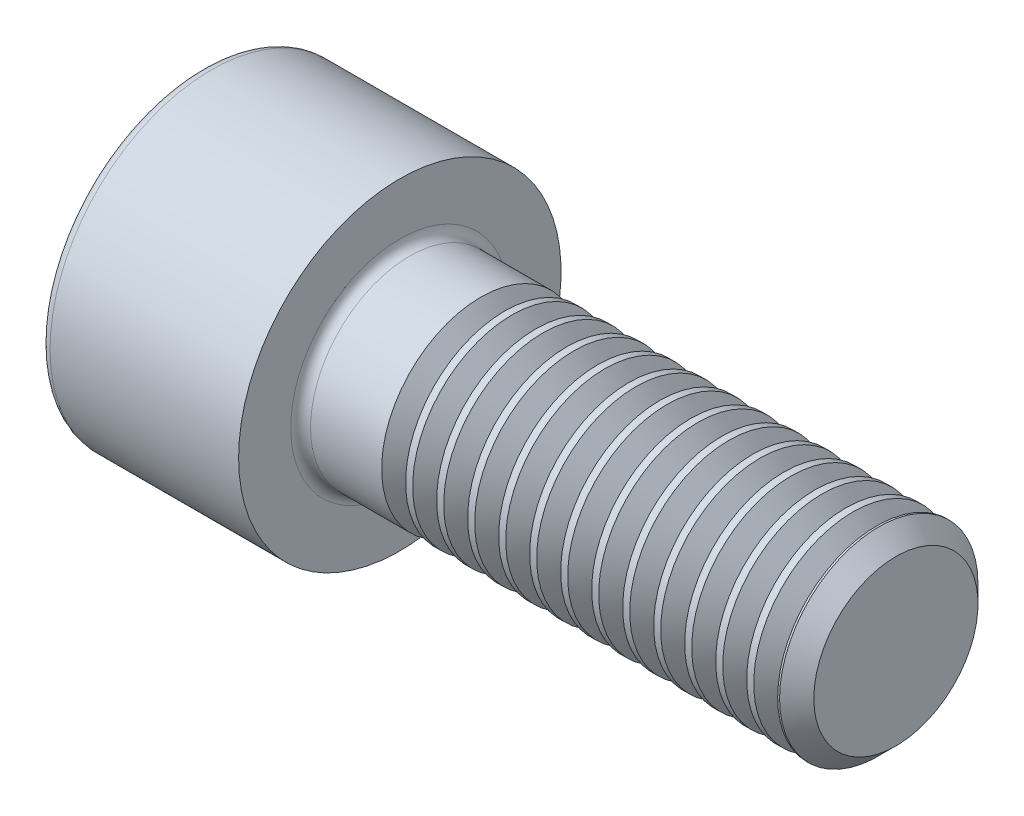
ISO-10303-21;
HEADER;
FILE_DESCRIPTION(('STEP AP214'),'2;1');
FILE_NAME('part.step','',(''),(''),'','','');
FILE_SCHEMA(('AUTOMOTIVE_DESIGN { 1 0 10303 214 1 1 1 1 }'));
ENDSEC;
DATA;
#1=APPLICATION_CONTEXT('core data for automotive mechanical design processes');
#2=APPLICATION_PROTOCOL_DEFINITION('international standard','automotive_design',2000,#1);
#3=PRODUCT_CONTEXT('',#1,'mechanical');
#4=PRODUCT('Part','Part','',(#3));
#5=PRODUCT_RELATED_PRODUCT_CATEGORY('part','',(#4));
#6=PRODUCT_DEFINITION_FORMATION('','',#4);
#7=PRODUCT_DEFINITION_CONTEXT('part definition',#1,'design');
#8=PRODUCT_DEFINITION('design','',#6,#7);
#9=PRODUCT_DEFINITION_SHAPE('','',#8);
#10=(LENGTH_UNIT() NAMED_UNIT(*) SI_UNIT(.MILLI.,.METRE.));
#11=(NAMED_UNIT(*) PLANE_ANGLE_UNIT() SI_UNIT($,.RADIAN.));
#12=(NAMED_UNIT(*) SI_UNIT($,.STERADIAN.) SOLID_ANGLE_UNIT());
#13=UNCERTAINTY_MEASURE_WITH_UNIT(LENGTH_MEASURE(1.E-05),#10,'distance_accuracy_value','');
#14=(GEOMETRIC_REPRESENTATION_CONTEXT(3) GLOBAL_UNCERTAINTY_ASSIGNED_CONTEXT((#13)) GLOBAL_UNIT_ASSIGNED_CONTEXT((#10,
#11,#12)) REPRESENTATION_CONTEXT('',''));
#15=CARTESIAN_POINT('',(0.,0.,0.));
#16=DIRECTION('',(0.,0.,1.));
#17=DIRECTION('',(1.,0.,0.));
#18=AXIS2_PLACEMENT_3D('',#15,#16,#17);
#19=CARTESIAN_POINT('',(0.,0.,0.));
#20=DIRECTION('',(-1.,0.,0.));
#21=DIRECTION('',(0.,0.,1.));
#22=AXIS2_PLACEMENT_3D('',#19,#20,#21);
#23=PLANE('',#22);
#24=DIRECTION('',(0.,-0.500000000000001,0.866025403784441));
#25=VECTOR('',#24,1.);
#26=CARTESIAN_POINT('',(0.,3.51894989071077,0.));
#27=LINE('',#26,#25);
#28=CARTESIAN_POINT('',(0.,3.51894989071077,0.));
#29=VERTEX_POINT('',#28);
#30=CARTESIAN_POINT('',(0.,1.75947494535539,3.04750000000001));
#31=VERTEX_POINT('',#30);
#32=EDGE_CURVE('E447',#29,#31,#27,.T.);
#33=ORIENTED_EDGE('',*,*,#32,.T.);
#34=DIRECTION('',(0.,1.,0.));
#35=VECTOR('',#34,1.);
#36=CARTESIAN_POINT('',(0.,-1.75947494535539,3.04750000000001));
#37=LINE('',#36,#35);
#38=CARTESIAN_POINT('',(0.,-1.75947494535539,3.04750000000001));
#39=VERTEX_POINT('',#38);
#40=EDGE_CURVE('E112',#39,#31,#37,.T.);
#41=ORIENTED_EDGE('',*,*,#40,.F.);
#42=DIRECTION('',(0.,-0.500000000000001,-0.86602540378444));
#43=VECTOR('',#42,1.);
#44=CARTESIAN_POINT('',(0.,-1.75947494535539,3.04750000000001));
#45=LINE('',#44,#43);
#46=CARTESIAN_POINT('',(0.,-3.51894989071078,0.));
#47=VERTEX_POINT('',#46);
#48=EDGE_CURVE('E466',#39,#47,#45,.T.);
#49=ORIENTED_EDGE('',*,*,#48,.T.);
#50=DIRECTION('',(0.,0.500000000000001,-0.866025403784441));
#51=VECTOR('',#50,1.);
#52=CARTESIAN_POINT('',(0.,-3.51894989071078,0.));
#53=LINE('',#52,#51);
#54=CARTESIAN_POINT('',(0.,-1.75947494535539,-3.04750000000001));
#55=VERTEX_POINT('',#54);
#56=EDGE_CURVE('E469',#47,#55,#53,.T.);
#57=ORIENTED_EDGE('',*,*,#56,.T.);
#58=DIRECTION('',(0.,-1.,0.));
#59=VECTOR('',#58,1.);
#60=CARTESIAN_POINT('',(0.,1.75947494535538,-3.04750000000001));
#61=LINE('',#60,#59);
#62=CARTESIAN_POINT('',(0.,1.75947494535538,-3.04750000000001));
#63=VERTEX_POINT('',#62);
#64=EDGE_CURVE('E472',#63,#55,#61,.T.);
#65=ORIENTED_EDGE('',*,*,#64,.F.);
#66=DIRECTION('',(0.,-0.500000000000001,-0.86602540378444));
#67=VECTOR('',#66,1.);
#68=CARTESIAN_POINT('',(0.,3.51894989071077,0.));
#69=LINE('',#68,#67);
#70=EDGE_CURVE('E107',#29,#63,#69,.T.);
#71=ORIENTED_EDGE('',*,*,#70,.F.);
#72=EDGE_LOOP('',(#33,#41,#49,#57,#65,#71));
#73=FACE_BOUND('',#72,.T.);
#74=CARTESIAN_POINT('',(0.,0.,0.));
#75=DIRECTION('',(-1.,0.,0.));
#76=DIRECTION('',(0.,0.,1.));
#77=AXIS2_PLACEMENT_3D('',#74,#75,#76);
#78=CIRCLE('',#77,6.1);
#79=CARTESIAN_POINT('',(0.,0.,6.10000000000001));
#80=VERTEX_POINT('',#79);
#81=EDGE_CURVE('E24',#80,#80,#78,.T.);
#82=ORIENTED_EDGE('',*,*,#81,.T.);
#83=EDGE_LOOP('',(#82));
#84=FACE_BOUND('',#83,.T.);
#85=ADVANCED_FACE('F16',(#73,#84),#23,.T.);
#86=CARTESIAN_POINT('',(-31.75,0.,0.));
#87=DIRECTION('',(-1.,0.,0.));
#88=DIRECTION('',(0.,0.,1.));
#89=AXIS2_PLACEMENT_3D('',#86,#87,#88);
#90=CYLINDRICAL_SURFACE('',#89,6.5);
#91=CARTESIAN_POINT('',(0.399999999999998,0.,0.));
#92=DIRECTION('',(-1.,0.,0.));
#93=DIRECTION('',(0.,0.,1.));
#94=AXIS2_PLACEMENT_3D('',#91,#92,#93);
#95=CIRCLE('',#94,6.5);
#96=CARTESIAN_POINT('',(0.399999999999998,0.,6.50000000000001));
#97=VERTEX_POINT('',#96);
#98=EDGE_CURVE('E11',#97,#97,#95,.F.);
#99=ORIENTED_EDGE('',*,*,#98,.T.);
#100=EDGE_LOOP('',(#99));
#101=FACE_BOUND('',#100,.T.);
#102=CARTESIAN_POINT('',(8.00000000000001,0.,0.));
#103=DIRECTION('',(-1.,0.,0.));
#104=DIRECTION('',(0.,0.,1.));
#105=AXIS2_PLACEMENT_3D('',#102,#103,#104);
#106=CIRCLE('',#105,6.5);
#107=CARTESIAN_POINT('',(8.00000000000001,0.,6.50000000000001));
#108=VERTEX_POINT('',#107);
#109=EDGE_CURVE('E130',#108,#108,#106,.T.);
#110=ORIENTED_EDGE('',*,*,#109,.T.);
#111=EDGE_LOOP('',(#110));
#112=FACE_BOUND('',#111,.T.);
#113=ADVANCED_FACE('F156',(#101,#112),#90,.T.);
#114=CARTESIAN_POINT('',(8.00000000000001,6.50000000000001,0.));
#115=DIRECTION('',(1.,0.,0.));
#116=DIRECTION('',(0.,0.,-1.));
#117=AXIS2_PLACEMENT_3D('',#114,#115,#116);
#118=PLANE('',#117);
#119=CARTESIAN_POINT('',(8.00000000000001,0.,0.));
#120=DIRECTION('',(1.,0.,0.));
#121=DIRECTION('',(0.,0.,-1.));
#122=AXIS2_PLACEMENT_3D('',#119,#120,#121);
#123=CIRCLE('',#122,4.4);
#124=CARTESIAN_POINT('',(8.00000000000001,0.,-4.40000000000001));
#125=VERTEX_POINT('',#124);
#126=EDGE_CURVE('E133',#125,#125,#123,.F.);
#127=ORIENTED_EDGE('',*,*,#126,.T.);
#128=EDGE_LOOP('',(#127));
#129=FACE_BOUND('',#128,.T.);
#130=ORIENTED_EDGE('',*,*,#109,.F.);
#131=EDGE_LOOP('',(#130));
#132=FACE_BOUND('',#131,.T.);
#133=ADVANCED_FACE('F163',(#129,#132),#118,.T.);
#134=CARTESIAN_POINT('',(-31.75,0.,0.));
#135=DIRECTION('',(-1.,0.,0.));
#136=DIRECTION('',(0.,0.,1.));
#137=AXIS2_PLACEMENT_3D('',#134,#135,#136);
#138=CYLINDRICAL_SURFACE('',#137,4.);
#139=CARTESIAN_POINT('',(11.2665066948662,0.,0.));
#140=DIRECTION('',(-1.,0.,0.));
#141=DIRECTION('',(0.,-1.,0.));
#142=AXIS2_PLACEMENT_3D('',#139,#140,#141);
#143=CIRCLE('',#142,4.);
#144=CARTESIAN_POINT('',(11.2665066948662,-4.00000000000001,0.));
#145=VERTEX_POINT('',#144);
#146=EDGE_CURVE('E442',#145,#145,#143,.T.);
#147=ORIENTED_EDGE('',*,*,#146,.T.);
#148=EDGE_LOOP('',(#147));
#149=FACE_BOUND('',#148,.T.);
#150=CARTESIAN_POINT('',(8.4,0.,0.));
#151=DIRECTION('',(1.,0.,0.));
#152=DIRECTION('',(0.,0.,-1.));
#153=AXIS2_PLACEMENT_3D('',#150,#151,#152);
#154=CIRCLE('',#153,4.);
#155=CARTESIAN_POINT('',(8.4,0.,-4.00000000000001));
#156=VERTEX_POINT('',#155);
#157=EDGE_CURVE('E136',#156,#156,#154,.T.);
#158=ORIENTED_EDGE('',*,*,#157,.T.);
#159=EDGE_LOOP('',(#158));
#160=FACE_BOUND('',#159,.T.);
#161=ADVANCED_FACE('F152',(#149,#160),#138,.T.);
#162=CARTESIAN_POINT('',(8.4,0.,0.));
#163=DIRECTION('',(1.,0.,0.));
#164=DIRECTION('',(0.,0.,-1.));
#165=AXIS2_PLACEMENT_3D('',#162,#163,#164);
#166=TOROIDAL_SURFACE('',#165,4.4,0.4);
#167=ORIENTED_EDGE('',*,*,#157,.F.);
#168=EDGE_LOOP('',(#167));
#169=FACE_BOUND('',#168,.T.);
#170=ORIENTED_EDGE('',*,*,#126,.F.);
#171=EDGE_LOOP('',(#170));
#172=FACE_BOUND('',#171,.T.);
#173=ADVANCED_FACE('F143',(#169,#172),#166,.F.);
#174=CARTESIAN_POINT('',(0.399999999999998,0.,0.));
#175=DIRECTION('',(-1.,0.,0.));
#176=DIRECTION('',(0.,0.,1.));
#177=AXIS2_PLACEMENT_3D('',#174,#175,#176);
#178=TOROIDAL_SURFACE('',#177,6.1,0.4);
#179=ORIENTED_EDGE('',*,*,#98,.F.);
#180=EDGE_LOOP('',(#179));
#181=FACE_BOUND('',#180,.T.);
#182=ORIENTED_EDGE('',*,*,#81,.F.);
#183=EDGE_LOOP('',(#182));
#184=FACE_BOUND('',#183,.T.);
#185=ADVANCED_FACE('F18',(#181,#184),#178,.T.);
#186=CARTESIAN_POINT('',(4.,3.51894989071077,0.));
#187=DIRECTION('',(0.,-0.866025403784441,-0.500000000000001));
#188=DIRECTION('',(0.,0.500000000000001,-0.866025403784441));
#189=AXIS2_PLACEMENT_3D('',#186,#187,#188);
#190=PLANE('',#189);
#191=ORIENTED_EDGE('',*,*,#32,.F.);
#192=DIRECTION('',(-1.,0.,0.));
#193=VECTOR('',#192,1.);
#194=CARTESIAN_POINT('',(4.,3.51894989071077,0.));
#195=LINE('',#194,#193);
#196=CARTESIAN_POINT('',(4.,3.51894989071077,0.));
#197=VERTEX_POINT('',#196);
#198=EDGE_CURVE('E463',#197,#29,#195,.T.);
#199=ORIENTED_EDGE('',*,*,#198,.F.);
#200=DIRECTION('',(0.,-0.500000000000001,0.866025403784441));
#201=VECTOR('',#200,1.);
#202=CARTESIAN_POINT('',(4.,3.51894989071077,0.));
#203=LINE('',#202,#201);
#204=CARTESIAN_POINT('',(4.,2.63921241803308,1.52375));
#205=VERTEX_POINT('',#204);
#206=EDGE_CURVE('E99',#197,#205,#203,.T.);
#207=ORIENTED_EDGE('',*,*,#206,.T.);
#208=CARTESIAN_POINT('',(4.,1.75947494535539,3.04750000000001));
#209=VERTEX_POINT('',#208);
#210=EDGE_CURVE('E90',#205,#209,#203,.T.);
#211=ORIENTED_EDGE('',*,*,#210,.T.);
#212=DIRECTION('',(-1.,0.,0.));
#213=VECTOR('',#212,1.);
#214=CARTESIAN_POINT('',(4.,1.75947494535539,3.04750000000001));
#215=LINE('',#214,#213);
#216=EDGE_CURVE('E104',#209,#31,#215,.T.);
#217=ORIENTED_EDGE('',*,*,#216,.T.);
#218=EDGE_LOOP('',(#191,#199,#207,#211,#217));
#219=FACE_BOUND('',#218,.T.);
#220=ADVANCED_FACE('F103',(#219),#190,.T.);
#221=CARTESIAN_POINT('',(4.,-1.75947494535539,3.04750000000001));
#222=DIRECTION('',(0.,0.,1.));
#223=DIRECTION('',(0.,-1.,0.));
#224=AXIS2_PLACEMENT_3D('',#221,#222,#223);
#225=PLANE('',#224);
#226=ORIENTED_EDGE('',*,*,#40,.T.);
#227=ORIENTED_EDGE('',*,*,#216,.F.);
#228=DIRECTION('',(0.,1.,0.));
#229=VECTOR('',#228,1.);
#230=CARTESIAN_POINT('',(4.,-1.75947494535539,3.04750000000001));
#231=LINE('',#230,#229);
#232=CARTESIAN_POINT('',(4.,0.,3.04750000000001));
#233=VERTEX_POINT('',#232);
#234=EDGE_CURVE('E87',#233,#209,#231,.T.);
#235=ORIENTED_EDGE('',*,*,#234,.F.);
#236=CARTESIAN_POINT('',(4.,-1.75947494535539,3.04750000000001));
#237=VERTEX_POINT('',#236);
#238=EDGE_CURVE('E98',#237,#233,#231,.T.);
#239=ORIENTED_EDGE('',*,*,#238,.F.);
#240=DIRECTION('',(-1.,0.,0.));
#241=VECTOR('',#240,1.);
#242=CARTESIAN_POINT('',(4.,-1.75947494535539,3.04750000000001));
#243=LINE('',#242,#241);
#244=EDGE_CURVE('E114',#237,#39,#243,.T.);
#245=ORIENTED_EDGE('',*,*,#244,.T.);
#246=EDGE_LOOP('',(#226,#227,#235,#239,#245));
#247=FACE_BOUND('',#246,.T.);
#248=ADVANCED_FACE('F109',(#247),#225,.F.);
#249=CARTESIAN_POINT('',(4.,-1.75947494535539,3.04750000000001));
#250=DIRECTION('',(0.,0.86602540378444,-0.500000000000001));
#251=DIRECTION('',(0.,0.500000000000001,0.86602540378444));
#252=AXIS2_PLACEMENT_3D('',#249,#250,#251);
#253=PLANE('',#252);
#254=ORIENTED_EDGE('',*,*,#48,.F.);
#255=ORIENTED_EDGE('',*,*,#244,.F.);
#256=DIRECTION('',(0.,-0.500000000000001,-0.86602540378444));
#257=VECTOR('',#256,1.);
#258=CARTESIAN_POINT('',(4.,-1.75947494535539,3.04750000000001));
#259=LINE('',#258,#257);
#260=CARTESIAN_POINT('',(4.,-2.63921241803308,1.52375));
#261=VERTEX_POINT('',#260);
#262=EDGE_CURVE('E450',#237,#261,#259,.T.);
#263=ORIENTED_EDGE('',*,*,#262,.T.);
#264=CARTESIAN_POINT('',(4.,-3.51894989071078,0.));
#265=VERTEX_POINT('',#264);
#266=EDGE_CURVE('E449',#261,#265,#259,.T.);
#267=ORIENTED_EDGE('',*,*,#266,.T.);
#268=DIRECTION('',(-1.,0.,0.));
#269=VECTOR('',#268,1.);
#270=CARTESIAN_POINT('',(4.,-3.51894989071078,0.));
#271=LINE('',#270,#269);
#272=EDGE_CURVE('E119',#265,#47,#271,.T.);
#273=ORIENTED_EDGE('',*,*,#272,.T.);
#274=EDGE_LOOP('',(#254,#255,#263,#267,#273));
#275=FACE_BOUND('',#274,.T.);
#276=ADVANCED_FACE('F191',(#275),#253,.T.);
#277=CARTESIAN_POINT('',(4.,-3.51894989071078,0.));
#278=DIRECTION('',(0.,0.866025403784441,0.500000000000001));
#279=DIRECTION('',(0.,-0.500000000000001,0.866025403784441));
#280=AXIS2_PLACEMENT_3D('',#277,#278,#279);
#281=PLANE('',#280);
#282=ORIENTED_EDGE('',*,*,#56,.F.);
#283=ORIENTED_EDGE('',*,*,#272,.F.);
#284=DIRECTION('',(0.,0.500000000000001,-0.866025403784441));
#285=VECTOR('',#284,1.);
#286=CARTESIAN_POINT('',(4.,-3.51894989071078,0.));
#287=LINE('',#286,#285);
#288=CARTESIAN_POINT('',(4.,-2.63921241803309,-1.52375));
#289=VERTEX_POINT('',#288);
#290=EDGE_CURVE('E454',#265,#289,#287,.T.);
#291=ORIENTED_EDGE('',*,*,#290,.T.);
#292=CARTESIAN_POINT('',(4.,-1.75947494535539,-3.04750000000001));
#293=VERTEX_POINT('',#292);
#294=EDGE_CURVE('E453',#289,#293,#287,.T.);
#295=ORIENTED_EDGE('',*,*,#294,.T.);
#296=DIRECTION('',(-1.,0.,0.));
#297=VECTOR('',#296,1.);
#298=CARTESIAN_POINT('',(4.,-1.75947494535539,-3.04750000000001));
#299=LINE('',#298,#297);
#300=EDGE_CURVE('E481',#293,#55,#299,.T.);
#301=ORIENTED_EDGE('',*,*,#300,.T.);
#302=EDGE_LOOP('',(#282,#283,#291,#295,#301));
#303=FACE_BOUND('',#302,.T.);
#304=ADVANCED_FACE('F194',(#303),#281,.T.);
#305=CARTESIAN_POINT('',(4.,1.75947494535538,-3.04750000000001));
#306=DIRECTION('',(0.,0.,-1.));
#307=DIRECTION('',(0.,1.,0.));
#308=AXIS2_PLACEMENT_3D('',#305,#306,#307);
#309=PLANE('',#308);
#310=ORIENTED_EDGE('',*,*,#64,.T.);
#311=ORIENTED_EDGE('',*,*,#300,.F.);
#312=DIRECTION('',(0.,-1.,0.));
#313=VECTOR('',#312,1.);
#314=CARTESIAN_POINT('',(4.,1.75947494535538,-3.04750000000001));
#315=LINE('',#314,#313);
#316=CARTESIAN_POINT('',(4.,0.,-3.04750000000001));
#317=VERTEX_POINT('',#316);
#318=EDGE_CURVE('E457',#317,#293,#315,.T.);
#319=ORIENTED_EDGE('',*,*,#318,.F.);
#320=CARTESIAN_POINT('',(4.,1.75947494535538,-3.04750000000001));
#321=VERTEX_POINT('',#320);
#322=EDGE_CURVE('E31',#321,#317,#315,.T.);
#323=ORIENTED_EDGE('',*,*,#322,.F.);
#324=DIRECTION('',(-1.,0.,0.));
#325=VECTOR('',#324,1.);
#326=CARTESIAN_POINT('',(4.,1.75947494535538,-3.04750000000001));
#327=LINE('',#326,#325);
#328=EDGE_CURVE('E478',#321,#63,#327,.T.);
#329=ORIENTED_EDGE('',*,*,#328,.T.);
#330=EDGE_LOOP('',(#310,#311,#319,#323,#329));
#331=FACE_BOUND('',#330,.T.);
#332=ADVANCED_FACE('F198',(#331),#309,.F.);
#333=CARTESIAN_POINT('',(4.,3.51894989071077,0.));
#334=DIRECTION('',(0.,0.86602540378444,-0.500000000000001));
#335=DIRECTION('',(0.,0.500000000000001,0.86602540378444));
#336=AXIS2_PLACEMENT_3D('',#333,#334,#335);
#337=PLANE('',#336);
#338=ORIENTED_EDGE('',*,*,#70,.T.);
#339=ORIENTED_EDGE('',*,*,#328,.F.);
#340=DIRECTION('',(0.,-0.500000000000001,-0.86602540378444));
#341=VECTOR('',#340,1.);
#342=CARTESIAN_POINT('',(4.,3.51894989071077,0.));
#343=LINE('',#342,#341);
#344=CARTESIAN_POINT('',(4.,2.63921241803308,-1.52375));
#345=VERTEX_POINT('',#344);
#346=EDGE_CURVE('E459',#345,#321,#343,.T.);
#347=ORIENTED_EDGE('',*,*,#346,.F.);
#348=EDGE_CURVE('E460',#197,#345,#343,.T.);
#349=ORIENTED_EDGE('',*,*,#348,.F.);
#350=ORIENTED_EDGE('',*,*,#198,.T.);
#351=EDGE_LOOP('',(#338,#339,#347,#349,#350));
#352=FACE_BOUND('',#351,.T.);
#353=ADVANCED_FACE('F202',(#352),#337,.F.);
#354=CARTESIAN_POINT('',(4.,3.51894989071077,0.));
#355=DIRECTION('',(1.,0.,0.));
#356=DIRECTION('',(0.,0.,-1.));
#357=AXIS2_PLACEMENT_3D('',#354,#355,#356);
#358=PLANE('',#357);
#359=ORIENTED_EDGE('',*,*,#318,.T.);
#360=ORIENTED_EDGE('',*,*,#294,.F.);
#361=CARTESIAN_POINT('',(4.,0.,0.));
#362=DIRECTION('',(-1.,0.,0.));
#363=DIRECTION('',(0.,0.,1.));
#364=AXIS2_PLACEMENT_3D('',#361,#362,#363);
#365=CIRCLE('',#364,3.0475);
#366=EDGE_CURVE('E498',#317,#289,#365,.T.);
#367=ORIENTED_EDGE('',*,*,#366,.F.);
#368=EDGE_LOOP('',(#359,#360,#367));
#369=FACE_BOUND('',#368,.T.);
#370=ADVANCED_FACE('F206',(#369),#358,.F.);
#371=ORIENTED_EDGE('',*,*,#290,.F.);
#372=ORIENTED_EDGE('',*,*,#266,.F.);
#373=EDGE_CURVE('E117',#289,#261,#365,.T.);
#374=ORIENTED_EDGE('',*,*,#373,.F.);
#375=EDGE_LOOP('',(#371,#372,#374));
#376=FACE_BOUND('',#375,.T.);
#377=ADVANCED_FACE('F210',(#376),#358,.F.);
#378=ORIENTED_EDGE('',*,*,#262,.F.);
#379=ORIENTED_EDGE('',*,*,#238,.T.);
#380=EDGE_CURVE('E113',#261,#233,#365,.T.);
#381=ORIENTED_EDGE('',*,*,#380,.F.);
#382=EDGE_LOOP('',(#378,#379,#381));
#383=FACE_BOUND('',#382,.T.);
#384=ADVANCED_FACE('F507',(#383),#358,.F.);
#385=ORIENTED_EDGE('',*,*,#234,.T.);
#386=ORIENTED_EDGE('',*,*,#210,.F.);
#387=EDGE_CURVE('E93',#233,#205,#365,.T.);
#388=ORIENTED_EDGE('',*,*,#387,.F.);
#389=EDGE_LOOP('',(#385,#386,#388));
#390=FACE_BOUND('',#389,.T.);
#391=ADVANCED_FACE('F89',(#390),#358,.F.);
#392=ORIENTED_EDGE('',*,*,#206,.F.);
#393=ORIENTED_EDGE('',*,*,#348,.T.);
#394=EDGE_CURVE('E124',#205,#345,#365,.T.);
#395=ORIENTED_EDGE('',*,*,#394,.F.);
#396=EDGE_LOOP('',(#392,#393,#395));
#397=FACE_BOUND('',#396,.T.);
#398=ADVANCED_FACE('F493',(#397),#358,.F.);
#399=ORIENTED_EDGE('',*,*,#346,.T.);
#400=ORIENTED_EDGE('',*,*,#322,.T.);
#401=EDGE_CURVE('E497',#345,#317,#365,.T.);
#402=ORIENTED_EDGE('',*,*,#401,.F.);
#403=EDGE_LOOP('',(#399,#400,#402));
#404=FACE_BOUND('',#403,.T.);
#405=ADVANCED_FACE('F187',(#404),#358,.F.);
#406=CARTESIAN_POINT('',(4.,0.,0.));
#407=DIRECTION('',(-1.,0.,0.));
#408=DIRECTION('',(0.,0.,1.));
#409=AXIS2_PLACEMENT_3D('',#406,#407,#408);
#410=CONICAL_SURFACE('',#409,3.0475,1.04719755119659);
#411=CARTESIAN_POINT('',(5.75947494535541,0.,0.));
#412=VERTEX_POINT('',#411);
#413=VERTEX_LOOP('',#412);
#414=FACE_BOUND('',#413,.T.);
#415=ORIENTED_EDGE('',*,*,#387,.T.);
#416=ORIENTED_EDGE('',*,*,#394,.T.);
#417=ORIENTED_EDGE('',*,*,#401,.T.);
#418=ORIENTED_EDGE('',*,*,#366,.T.);
#419=ORIENTED_EDGE('',*,*,#373,.T.);
#420=ORIENTED_EDGE('',*,*,#380,.T.);
#421=EDGE_LOOP('',(#415,#416,#417,#418,#419,#420));
#422=FACE_BOUND('',#421,.T.);
#423=ADVANCED_FACE('F184',(#414,#422),#410,.F.);
#424=CARTESIAN_POINT('',(12.2334933051338,0.,0.));
#425=DIRECTION('',(1.,0.,0.));
#426=DIRECTION('',(0.,1.,0.));
#427=AXIS2_PLACEMENT_3D('',#424,#425,#426);
#428=CONICAL_SURFACE('',#427,4.,0.959931088596884);
#429=CARTESIAN_POINT('',(11.75,0.,0.));
#430=DIRECTION('',(-1.,0.,0.));
#431=DIRECTION('',(0.,-1.,0.));
#432=AXIS2_PLACEMENT_3D('',#429,#430,#431);
#433=CIRCLE('',#432,3.3095);
#434=CARTESIAN_POINT('',(11.75,-3.30950000000001,0.));
#435=VERTEX_POINT('',#434);
#436=EDGE_CURVE('E439',#435,#435,#433,.T.);
#437=ORIENTED_EDGE('',*,*,#436,.F.);
#438=EDGE_LOOP('',(#437));
#439=FACE_BOUND('',#438,.T.);
#440=CARTESIAN_POINT('',(12.2334933051338,0.,0.));
#441=DIRECTION('',(-1.,0.,0.));
#442=DIRECTION('',(0.,-1.,0.));
#443=AXIS2_PLACEMENT_3D('',#440,#441,#442);
#444=CIRCLE('',#443,4.);
#445=CARTESIAN_POINT('',(12.2334933051338,-4.00000000000001,0.));
#446=VERTEX_POINT('',#445);
#447=EDGE_CURVE('E445',#446,#446,#444,.T.);
#448=ORIENTED_EDGE('',*,*,#447,.T.);
#449=EDGE_LOOP('',(#448));
#450=FACE_BOUND('',#449,.T.);
#451=ADVANCED_FACE('F186',(#439,#450),#428,.T.);
#452=CARTESIAN_POINT('',(11.75,0.,0.));
#453=DIRECTION('',(-1.,0.,0.));
#454=DIRECTION('',(0.,-1.,0.));
#455=AXIS2_PLACEMENT_3D('',#452,#453,#454);
#456=CONICAL_SURFACE('',#455,3.3095,0.959931088596876);
#457=ORIENTED_EDGE('',*,*,#146,.F.);
#458=EDGE_LOOP('',(#457));
#459=FACE_BOUND('',#458,.T.);
#460=ORIENTED_EDGE('',*,*,#436,.T.);
#461=EDGE_LOOP('',(#460));
#462=FACE_BOUND('',#461,.T.);
#463=ADVANCED_FACE('F214',(#459,#462),#456,.T.);
#464=CARTESIAN_POINT('',(12.5165066948662,0.,0.));
#465=DIRECTION('',(-1.,0.,0.));
#466=DIRECTION('',(0.,-1.,0.));
#467=AXIS2_PLACEMENT_3D('',#464,#465,#466);
#468=CIRCLE('',#467,4.);
#469=CARTESIAN_POINT('',(12.5165066948662,-4.00000000000001,0.));
#470=VERTEX_POINT('',#469);
#471=EDGE_CURVE('E433',#470,#470,#468,.T.);
#472=ORIENTED_EDGE('',*,*,#471,.T.);
#473=EDGE_LOOP('',(#472));
#474=FACE_BOUND('',#473,.T.);
#475=ORIENTED_EDGE('',*,*,#447,.F.);
#476=EDGE_LOOP('',(#475));
#477=FACE_BOUND('',#476,.T.);
#478=ADVANCED_FACE('F174',(#474,#477),#138,.T.);
#479=CARTESIAN_POINT('',(13.4834933051338,0.,0.));
#480=DIRECTION('',(1.,0.,0.));
#481=DIRECTION('',(0.,1.,0.));
#482=AXIS2_PLACEMENT_3D('',#479,#480,#481);
#483=CONICAL_SURFACE('',#482,4.,0.959931088596884);
#484=CARTESIAN_POINT('',(13.,0.,0.));
#485=DIRECTION('',(-1.,0.,0.));
#486=DIRECTION('',(0.,-1.,0.));
#487=AXIS2_PLACEMENT_3D('',#484,#485,#486);
#488=CIRCLE('',#487,3.3095);
#489=CARTESIAN_POINT('',(13.,-3.30950000000001,0.));
#490=VERTEX_POINT('',#489);
#491=EDGE_CURVE('E430',#490,#490,#488,.T.);
#492=ORIENTED_EDGE('',*,*,#491,.F.);
#493=EDGE_LOOP('',(#492));
#494=FACE_BOUND('',#493,.T.);
#495=CARTESIAN_POINT('',(13.4834933051338,0.,0.));
#496=DIRECTION('',(-1.,0.,0.));
#497=DIRECTION('',(0.,-1.,0.));
#498=AXIS2_PLACEMENT_3D('',#495,#496,#497);
#499=CIRCLE('',#498,4.);
#500=CARTESIAN_POINT('',(13.4834933051338,-4.00000000000001,0.));
#501=VERTEX_POINT('',#500);
#502=EDGE_CURVE('E436',#501,#501,#499,.T.);
#503=ORIENTED_EDGE('',*,*,#502,.T.);
#504=EDGE_LOOP('',(#503));
#505=FACE_BOUND('',#504,.T.);
#506=ADVANCED_FACE('F219',(#494,#505),#483,.T.);
#507=CARTESIAN_POINT('',(13.,0.,0.));
#508=DIRECTION('',(-1.,0.,0.));
#509=DIRECTION('',(0.,-1.,0.));
#510=AXIS2_PLACEMENT_3D('',#507,#508,#509);
#511=CONICAL_SURFACE('',#510,3.3095,0.959931088596876);
#512=ORIENTED_EDGE('',*,*,#471,.F.);
#513=EDGE_LOOP('',(#512));
#514=FACE_BOUND('',#513,.T.);
#515=ORIENTED_EDGE('',*,*,#491,.T.);
#516=EDGE_LOOP('',(#515));
#517=FACE_BOUND('',#516,.T.);
#518=ADVANCED_FACE('F222',(#514,#517),#511,.T.);
#519=CARTESIAN_POINT('',(13.7665066948662,0.,0.));
#520=DIRECTION('',(-1.,0.,0.));
#521=DIRECTION('',(0.,-1.,0.));
#522=AXIS2_PLACEMENT_3D('',#519,#520,#521);
#523=CIRCLE('',#522,4.);
#524=CARTESIAN_POINT('',(13.7665066948662,-4.00000000000001,0.));
#525=VERTEX_POINT('',#524);
#526=EDGE_CURVE('E424',#525,#525,#523,.T.);
#527=ORIENTED_EDGE('',*,*,#526,.T.);
#528=EDGE_LOOP('',(#527));
#529=FACE_BOUND('',#528,.T.);
#530=ORIENTED_EDGE('',*,*,#502,.F.);
#531=EDGE_LOOP('',(#530));
#532=FACE_BOUND('',#531,.T.);
#533=ADVANCED_FACE('F226',(#529,#532),#138,.T.);
#534=CARTESIAN_POINT('',(14.7334933051338,0.,0.));
#535=DIRECTION('',(1.,0.,0.));
#536=DIRECTION('',(0.,1.,0.));
#537=AXIS2_PLACEMENT_3D('',#534,#535,#536);
#538=CONICAL_SURFACE('',#537,4.,0.959931088596884);
#539=CARTESIAN_POINT('',(14.25,0.,0.));
#540=DIRECTION('',(-1.,0.,0.));
#541=DIRECTION('',(0.,-1.,0.));
#542=AXIS2_PLACEMENT_3D('',#539,#540,#541);
#543=CIRCLE('',#542,3.3095);
#544=CARTESIAN_POINT('',(14.25,-3.30950000000001,0.));
#545=VERTEX_POINT('',#544);
#546=EDGE_CURVE('E421',#545,#545,#543,.T.);
#547=ORIENTED_EDGE('',*,*,#546,.F.);
#548=EDGE_LOOP('',(#547));
#549=FACE_BOUND('',#548,.T.);
#550=CARTESIAN_POINT('',(14.7334933051338,0.,0.));
#551=DIRECTION('',(-1.,0.,0.));
#552=DIRECTION('',(0.,-1.,0.));
#553=AXIS2_PLACEMENT_3D('',#550,#551,#552);
#554=CIRCLE('',#553,4.);
#555=CARTESIAN_POINT('',(14.7334933051338,-4.00000000000001,0.));
#556=VERTEX_POINT('',#555);
#557=EDGE_CURVE('E427',#556,#556,#554,.T.);
#558=ORIENTED_EDGE('',*,*,#557,.T.);
#559=EDGE_LOOP('',(#558));
#560=FACE_BOUND('',#559,.T.);
#561=ADVANCED_FACE('F228',(#549,#560),#538,.T.);
#562=CARTESIAN_POINT('',(14.25,0.,0.));
#563=DIRECTION('',(-1.,0.,0.));
#564=DIRECTION('',(0.,-1.,0.));
#565=AXIS2_PLACEMENT_3D('',#562,#563,#564);
#566=CONICAL_SURFACE('',#565,3.3095,0.959931088596876);
#567=ORIENTED_EDGE('',*,*,#526,.F.);
#568=EDGE_LOOP('',(#567));
#569=FACE_BOUND('',#568,.T.);
#570=ORIENTED_EDGE('',*,*,#546,.T.);
#571=EDGE_LOOP('',(#570));
#572=FACE_BOUND('',#571,.T.);
#573=ADVANCED_FACE('F231',(#569,#572),#566,.T.);
#574=CARTESIAN_POINT('',(15.0165066948662,0.,0.));
#575=DIRECTION('',(-1.,0.,0.));
#576=DIRECTION('',(0.,-1.,0.));
#577=AXIS2_PLACEMENT_3D('',#574,#575,#576);
#578=CIRCLE('',#577,4.);
#579=CARTESIAN_POINT('',(15.0165066948662,-4.00000000000001,0.));
#580=VERTEX_POINT('',#579);
#581=EDGE_CURVE('E415',#580,#580,#578,.T.);
#582=ORIENTED_EDGE('',*,*,#581,.T.);
#583=EDGE_LOOP('',(#582));
#584=FACE_BOUND('',#583,.T.);
#585=ORIENTED_EDGE('',*,*,#557,.F.);
#586=EDGE_LOOP('',(#585));
#587=FACE_BOUND('',#586,.T.);
#588=ADVANCED_FACE('F235',(#584,#587),#138,.T.);
#589=CARTESIAN_POINT('',(15.9834933051338,0.,0.));
#590=DIRECTION('',(1.,0.,0.));
#591=DIRECTION('',(0.,1.,0.));
#592=AXIS2_PLACEMENT_3D('',#589,#590,#591);
#593=CONICAL_SURFACE('',#592,4.,0.959931088596884);
#594=CARTESIAN_POINT('',(15.5,0.,0.));
#595=DIRECTION('',(-1.,0.,0.));
#596=DIRECTION('',(0.,-1.,0.));
#597=AXIS2_PLACEMENT_3D('',#594,#595,#596);
#598=CIRCLE('',#597,3.3095);
#599=CARTESIAN_POINT('',(15.5,-3.30950000000001,0.));
#600=VERTEX_POINT('',#599);
#601=EDGE_CURVE('E412',#600,#600,#598,.T.);
#602=ORIENTED_EDGE('',*,*,#601,.F.);
#603=EDGE_LOOP('',(#602));
#604=FACE_BOUND('',#603,.T.);
#605=CARTESIAN_POINT('',(15.9834933051338,0.,0.));
#606=DIRECTION('',(-1.,0.,0.));
#607=DIRECTION('',(0.,-1.,0.));
#608=AXIS2_PLACEMENT_3D('',#605,#606,#607);
#609=CIRCLE('',#608,4.);
#610=CARTESIAN_POINT('',(15.9834933051338,-4.00000000000001,0.));
#611=VERTEX_POINT('',#610);
#612=EDGE_CURVE('E418',#611,#611,#609,.T.);
#613=ORIENTED_EDGE('',*,*,#612,.T.);
#614=EDGE_LOOP('',(#613));
#615=FACE_BOUND('',#614,.T.);
#616=ADVANCED_FACE('F237',(#604,#615),#593,.T.);
#617=CARTESIAN_POINT('',(15.5,0.,0.));
#618=DIRECTION('',(-1.,0.,0.));
#619=DIRECTION('',(0.,-1.,0.));
#620=AXIS2_PLACEMENT_3D('',#617,#618,#619);
#621=CONICAL_SURFACE('',#620,3.3095,0.959931088596876);
#622=ORIENTED_EDGE('',*,*,#581,.F.);
#623=EDGE_LOOP('',(#622));
#624=FACE_BOUND('',#623,.T.);
#625=ORIENTED_EDGE('',*,*,#601,.T.);
#626=EDGE_LOOP('',(#625));
#627=FACE_BOUND('',#626,.T.);
#628=ADVANCED_FACE('F240',(#624,#627),#621,.T.);
#629=CARTESIAN_POINT('',(16.2665066948662,0.,0.));
#630=DIRECTION('',(-1.,0.,0.));
#631=DIRECTION('',(0.,-1.,0.));
#632=AXIS2_PLACEMENT_3D('',#629,#630,#631);
#633=CIRCLE('',#632,4.);
#634=CARTESIAN_POINT('',(16.2665066948662,-4.00000000000001,0.));
#635=VERTEX_POINT('',#634);
#636=EDGE_CURVE('E406',#635,#635,#633,.T.);
#637=ORIENTED_EDGE('',*,*,#636,.T.);
#638=EDGE_LOOP('',(#637));
#639=FACE_BOUND('',#638,.T.);
#640=ORIENTED_EDGE('',*,*,#612,.F.);
#641=EDGE_LOOP('',(#640));
#642=FACE_BOUND('',#641,.T.);
#643=ADVANCED_FACE('F244',(#639,#642),#138,.T.);
#644=CARTESIAN_POINT('',(17.2334933051338,0.,0.));
#645=DIRECTION('',(1.,0.,0.));
#646=DIRECTION('',(0.,1.,0.));
#647=AXIS2_PLACEMENT_3D('',#644,#645,#646);
#648=CONICAL_SURFACE('',#647,4.,0.959931088596884);
#649=CARTESIAN_POINT('',(16.75,0.,0.));
#650=DIRECTION('',(-1.,0.,0.));
#651=DIRECTION('',(0.,-1.,0.));
#652=AXIS2_PLACEMENT_3D('',#649,#650,#651);
#653=CIRCLE('',#652,3.3095);
#654=CARTESIAN_POINT('',(16.75,-3.30950000000001,0.));
#655=VERTEX_POINT('',#654);
#656=EDGE_CURVE('E403',#655,#655,#653,.T.);
#657=ORIENTED_EDGE('',*,*,#656,.F.);
#658=EDGE_LOOP('',(#657));
#659=FACE_BOUND('',#658,.T.);
#660=CARTESIAN_POINT('',(17.2334933051338,0.,0.));
#661=DIRECTION('',(-1.,0.,0.));
#662=DIRECTION('',(0.,-1.,0.));
#663=AXIS2_PLACEMENT_3D('',#660,#661,#662);
#664=CIRCLE('',#663,4.);
#665=CARTESIAN_POINT('',(17.2334933051338,-4.00000000000001,0.));
#666=VERTEX_POINT('',#665);
#667=EDGE_CURVE('E409',#666,#666,#664,.T.);
#668=ORIENTED_EDGE('',*,*,#667,.T.);
#669=EDGE_LOOP('',(#668));
#670=FACE_BOUND('',#669,.T.);
#671=ADVANCED_FACE('F246',(#659,#670),#648,.T.);
#672=CARTESIAN_POINT('',(16.75,0.,0.));
#673=DIRECTION('',(-1.,0.,0.));
#674=DIRECTION('',(0.,-1.,0.));
#675=AXIS2_PLACEMENT_3D('',#672,#673,#674);
#676=CONICAL_SURFACE('',#675,3.3095,0.959931088596876);
#677=ORIENTED_EDGE('',*,*,#636,.F.);
#678=EDGE_LOOP('',(#677));
#679=FACE_BOUND('',#678,.T.);
#680=ORIENTED_EDGE('',*,*,#656,.T.);
#681=EDGE_LOOP('',(#680));
#682=FACE_BOUND('',#681,.T.);
#683=ADVANCED_FACE('F249',(#679,#682),#676,.T.);
#684=CARTESIAN_POINT('',(17.5165066948662,0.,0.));
#685=DIRECTION('',(-1.,0.,0.));
#686=DIRECTION('',(0.,-1.,0.));
#687=AXIS2_PLACEMENT_3D('',#684,#685,#686);
#688=CIRCLE('',#687,4.);
#689=CARTESIAN_POINT('',(17.5165066948662,-4.00000000000001,0.));
#690=VERTEX_POINT('',#689);
#691=EDGE_CURVE('E397',#690,#690,#688,.T.);
#692=ORIENTED_EDGE('',*,*,#691,.T.);
#693=EDGE_LOOP('',(#692));
#694=FACE_BOUND('',#693,.T.);
#695=ORIENTED_EDGE('',*,*,#667,.F.);
#696=EDGE_LOOP('',(#695));
#697=FACE_BOUND('',#696,.T.);
#698=ADVANCED_FACE('F253',(#694,#697),#138,.T.);
#699=CARTESIAN_POINT('',(18.4834933051338,0.,0.));
#700=DIRECTION('',(1.,0.,0.));
#701=DIRECTION('',(0.,1.,0.));
#702=AXIS2_PLACEMENT_3D('',#699,#700,#701);
#703=CONICAL_SURFACE('',#702,4.,0.959931088596884);
#704=CARTESIAN_POINT('',(18.,0.,0.));
#705=DIRECTION('',(-1.,0.,0.));
#706=DIRECTION('',(0.,-1.,0.));
#707=AXIS2_PLACEMENT_3D('',#704,#705,#706);
#708=CIRCLE('',#707,3.3095);
#709=CARTESIAN_POINT('',(18.,-3.30950000000001,0.));
#710=VERTEX_POINT('',#709);
#711=EDGE_CURVE('E394',#710,#710,#708,.T.);
#712=ORIENTED_EDGE('',*,*,#711,.F.);
#713=EDGE_LOOP('',(#712));
#714=FACE_BOUND('',#713,.T.);
#715=CARTESIAN_POINT('',(18.4834933051338,0.,0.));
#716=DIRECTION('',(-1.,0.,0.));
#717=DIRECTION('',(0.,-1.,0.));
#718=AXIS2_PLACEMENT_3D('',#715,#716,#717);
#719=CIRCLE('',#718,4.);
#720=CARTESIAN_POINT('',(18.4834933051338,-4.00000000000001,0.));
#721=VERTEX_POINT('',#720);
#722=EDGE_CURVE('E400',#721,#721,#719,.T.);
#723=ORIENTED_EDGE('',*,*,#722,.T.);
#724=EDGE_LOOP('',(#723));
#725=FACE_BOUND('',#724,.T.);
#726=ADVANCED_FACE('F255',(#714,#725),#703,.T.);
#727=CARTESIAN_POINT('',(18.,0.,0.));
#728=DIRECTION('',(-1.,0.,0.));
#729=DIRECTION('',(0.,-1.,0.));
#730=AXIS2_PLACEMENT_3D('',#727,#728,#729);
#731=CONICAL_SURFACE('',#730,3.3095,0.959931088596876);
#732=ORIENTED_EDGE('',*,*,#691,.F.);
#733=EDGE_LOOP('',(#732));
#734=FACE_BOUND('',#733,.T.);
#735=ORIENTED_EDGE('',*,*,#711,.T.);
#736=EDGE_LOOP('',(#735));
#737=FACE_BOUND('',#736,.T.);
#738=ADVANCED_FACE('F258',(#734,#737),#731,.T.);
#739=CARTESIAN_POINT('',(18.7665066948662,0.,0.));
#740=DIRECTION('',(-1.,0.,0.));
#741=DIRECTION('',(0.,-1.,0.));
#742=AXIS2_PLACEMENT_3D('',#739,#740,#741);
#743=CIRCLE('',#742,4.);
#744=CARTESIAN_POINT('',(18.7665066948662,-4.00000000000001,0.));
#745=VERTEX_POINT('',#744);
#746=EDGE_CURVE('E388',#745,#745,#743,.T.);
#747=ORIENTED_EDGE('',*,*,#746,.T.);
#748=EDGE_LOOP('',(#747));
#749=FACE_BOUND('',#748,.T.);
#750=ORIENTED_EDGE('',*,*,#722,.F.);
#751=EDGE_LOOP('',(#750));
#752=FACE_BOUND('',#751,.T.);
#753=ADVANCED_FACE('F262',(#749,#752),#138,.T.);
#754=CARTESIAN_POINT('',(19.7334933051338,0.,0.));
#755=DIRECTION('',(1.,0.,0.));
#756=DIRECTION('',(0.,1.,0.));
#757=AXIS2_PLACEMENT_3D('',#754,#755,#756);
#758=CONICAL_SURFACE('',#757,4.,0.959931088596884);
#759=CARTESIAN_POINT('',(19.25,0.,0.));
#760=DIRECTION('',(-1.,0.,0.));
#761=DIRECTION('',(0.,-1.,0.));
#762=AXIS2_PLACEMENT_3D('',#759,#760,#761);
#763=CIRCLE('',#762,3.3095);
#764=CARTESIAN_POINT('',(19.25,-3.30950000000001,0.));
#765=VERTEX_POINT('',#764);
#766=EDGE_CURVE('E385',#765,#765,#763,.T.);
#767=ORIENTED_EDGE('',*,*,#766,.F.);
#768=EDGE_LOOP('',(#767));
#769=FACE_BOUND('',#768,.T.);
#770=CARTESIAN_POINT('',(19.7334933051338,0.,0.));
#771=DIRECTION('',(-1.,0.,0.));
#772=DIRECTION('',(0.,-1.,0.));
#773=AXIS2_PLACEMENT_3D('',#770,#771,#772);
#774=CIRCLE('',#773,4.);
#775=CARTESIAN_POINT('',(19.7334933051338,-4.00000000000001,0.));
#776=VERTEX_POINT('',#775);
#777=EDGE_CURVE('E391',#776,#776,#774,.T.);
#778=ORIENTED_EDGE('',*,*,#777,.T.);
#779=EDGE_LOOP('',(#778));
#780=FACE_BOUND('',#779,.T.);
#781=ADVANCED_FACE('F264',(#769,#780),#758,.T.);
#782=CARTESIAN_POINT('',(19.25,0.,0.));
#783=DIRECTION('',(-1.,0.,0.));
#784=DIRECTION('',(0.,-1.,0.));
#785=AXIS2_PLACEMENT_3D('',#782,#783,#784);
#786=CONICAL_SURFACE('',#785,3.3095,0.959931088596876);
#787=ORIENTED_EDGE('',*,*,#746,.F.);
#788=EDGE_LOOP('',(#787));
#789=FACE_BOUND('',#788,.T.);
#790=ORIENTED_EDGE('',*,*,#766,.T.);
#791=EDGE_LOOP('',(#790));
#792=FACE_BOUND('',#791,.T.);
#793=ADVANCED_FACE('F267',(#789,#792),#786,.T.);
#794=CARTESIAN_POINT('',(20.0165066948662,0.,0.));
#795=DIRECTION('',(-1.,0.,0.));
#796=DIRECTION('',(0.,-1.,0.));
#797=AXIS2_PLACEMENT_3D('',#794,#795,#796);
#798=CIRCLE('',#797,4.);
#799=CARTESIAN_POINT('',(20.0165066948662,-4.00000000000001,0.));
#800=VERTEX_POINT('',#799);
#801=EDGE_CURVE('E379',#800,#800,#798,.T.);
#802=ORIENTED_EDGE('',*,*,#801,.T.);
#803=EDGE_LOOP('',(#802));
#804=FACE_BOUND('',#803,.T.);
#805=ORIENTED_EDGE('',*,*,#777,.F.);
#806=EDGE_LOOP('',(#805));
#807=FACE_BOUND('',#806,.T.);
#808=ADVANCED_FACE('F271',(#804,#807),#138,.T.);
#809=CARTESIAN_POINT('',(20.9834933051338,0.,0.));
#810=DIRECTION('',(1.,0.,0.));
#811=DIRECTION('',(0.,1.,0.));
#812=AXIS2_PLACEMENT_3D('',#809,#810,#811);
#813=CONICAL_SURFACE('',#812,4.,0.959931088596884);
#814=CARTESIAN_POINT('',(20.5,0.,0.));
#815=DIRECTION('',(-1.,0.,0.));
#816=DIRECTION('',(0.,-1.,0.));
#817=AXIS2_PLACEMENT_3D('',#814,#815,#816);
#818=CIRCLE('',#817,3.3095);
#819=CARTESIAN_POINT('',(20.5,-3.30950000000001,0.));
#820=VERTEX_POINT('',#819);
#821=EDGE_CURVE('E376',#820,#820,#818,.T.);
#822=ORIENTED_EDGE('',*,*,#821,.F.);
#823=EDGE_LOOP('',(#822));
#824=FACE_BOUND('',#823,.T.);
#825=CARTESIAN_POINT('',(20.9834933051338,0.,0.));
#826=DIRECTION('',(-1.,0.,0.));
#827=DIRECTION('',(0.,-1.,0.));
#828=AXIS2_PLACEMENT_3D('',#825,#826,#827);
#829=CIRCLE('',#828,4.);
#830=CARTESIAN_POINT('',(20.9834933051338,-4.00000000000001,0.));
#831=VERTEX_POINT('',#830);
#832=EDGE_CURVE('E382',#831,#831,#829,.T.);
#833=ORIENTED_EDGE('',*,*,#832,.T.);
#834=EDGE_LOOP('',(#833));
#835=FACE_BOUND('',#834,.T.);
#836=ADVANCED_FACE('F273',(#824,#835),#813,.T.);
#837=CARTESIAN_POINT('',(20.5,0.,0.));
#838=DIRECTION('',(-1.,0.,0.));
#839=DIRECTION('',(0.,-1.,0.));
#840=AXIS2_PLACEMENT_3D('',#837,#838,#839);
#841=CONICAL_SURFACE('',#840,3.3095,0.959931088596876);
#842=ORIENTED_EDGE('',*,*,#801,.F.);
#843=EDGE_LOOP('',(#842));
#844=FACE_BOUND('',#843,.T.);
#845=ORIENTED_EDGE('',*,*,#821,.T.);
#846=EDGE_LOOP('',(#845));
#847=FACE_BOUND('',#846,.T.);
#848=ADVANCED_FACE('F276',(#844,#847),#841,.T.);
#849=CARTESIAN_POINT('',(21.2665066948662,0.,0.));
#850=DIRECTION('',(-1.,0.,0.));
#851=DIRECTION('',(0.,-1.,0.));
#852=AXIS2_PLACEMENT_3D('',#849,#850,#851);
#853=CIRCLE('',#852,4.);
#854=CARTESIAN_POINT('',(21.2665066948662,-4.00000000000001,0.));
#855=VERTEX_POINT('',#854);
#856=EDGE_CURVE('E370',#855,#855,#853,.T.);
#857=ORIENTED_EDGE('',*,*,#856,.T.);
#858=EDGE_LOOP('',(#857));
#859=FACE_BOUND('',#858,.T.);
#860=ORIENTED_EDGE('',*,*,#832,.F.);
#861=EDGE_LOOP('',(#860));
#862=FACE_BOUND('',#861,.T.);
#863=ADVANCED_FACE('F280',(#859,#862),#138,.T.);
#864=CARTESIAN_POINT('',(22.2334933051338,0.,0.));
#865=DIRECTION('',(1.,0.,0.));
#866=DIRECTION('',(0.,1.,0.));
#867=AXIS2_PLACEMENT_3D('',#864,#865,#866);
#868=CONICAL_SURFACE('',#867,4.,0.959931088596884);
#869=CARTESIAN_POINT('',(21.75,0.,0.));
#870=DIRECTION('',(-1.,0.,0.));
#871=DIRECTION('',(0.,-1.,0.));
#872=AXIS2_PLACEMENT_3D('',#869,#870,#871);
#873=CIRCLE('',#872,3.3095);
#874=CARTESIAN_POINT('',(21.75,-3.30950000000001,0.));
#875=VERTEX_POINT('',#874);
#876=EDGE_CURVE('E367',#875,#875,#873,.T.);
#877=ORIENTED_EDGE('',*,*,#876,.F.);
#878=EDGE_LOOP('',(#877));
#879=FACE_BOUND('',#878,.T.);
#880=CARTESIAN_POINT('',(22.2334933051338,0.,0.));
#881=DIRECTION('',(-1.,0.,0.));
#882=DIRECTION('',(0.,-1.,0.));
#883=AXIS2_PLACEMENT_3D('',#880,#881,#882);
#884=CIRCLE('',#883,4.);
#885=CARTESIAN_POINT('',(22.2334933051338,-4.00000000000001,0.));
#886=VERTEX_POINT('',#885);
#887=EDGE_CURVE('E373',#886,#886,#884,.T.);
#888=ORIENTED_EDGE('',*,*,#887,.T.);
#889=EDGE_LOOP('',(#888));
#890=FACE_BOUND('',#889,.T.);
#891=ADVANCED_FACE('F282',(#879,#890),#868,.T.);
#892=CARTESIAN_POINT('',(21.75,0.,0.));
#893=DIRECTION('',(-1.,0.,0.));
#894=DIRECTION('',(0.,-1.,0.));
#895=AXIS2_PLACEMENT_3D('',#892,#893,#894);
#896=CONICAL_SURFACE('',#895,3.3095,0.959931088596876);
#897=ORIENTED_EDGE('',*,*,#856,.F.);
#898=EDGE_LOOP('',(#897));
#899=FACE_BOUND('',#898,.T.);
#900=ORIENTED_EDGE('',*,*,#876,.T.);
#901=EDGE_LOOP('',(#900));
#902=FACE_BOUND('',#901,.T.);
#903=ADVANCED_FACE('F285',(#899,#902),#896,.T.);
#904=CARTESIAN_POINT('',(22.5165066948662,0.,0.));
#905=DIRECTION('',(-1.,0.,0.));
#906=DIRECTION('',(0.,-1.,0.));
#907=AXIS2_PLACEMENT_3D('',#904,#905,#906);
#908=CIRCLE('',#907,4.);
#909=CARTESIAN_POINT('',(22.5165066948662,-4.00000000000001,0.));
#910=VERTEX_POINT('',#909);
#911=EDGE_CURVE('E361',#910,#910,#908,.T.);
#912=ORIENTED_EDGE('',*,*,#911,.T.);
#913=EDGE_LOOP('',(#912));
#914=FACE_BOUND('',#913,.T.);
#915=ORIENTED_EDGE('',*,*,#887,.F.);
#916=EDGE_LOOP('',(#915));
#917=FACE_BOUND('',#916,.T.);
#918=ADVANCED_FACE('F289',(#914,#917),#138,.T.);
#919=CARTESIAN_POINT('',(23.4834933051338,0.,0.));
#920=DIRECTION('',(1.,0.,0.));
#921=DIRECTION('',(0.,1.,0.));
#922=AXIS2_PLACEMENT_3D('',#919,#920,#921);
#923=CONICAL_SURFACE('',#922,4.,0.959931088596884);
#924=CARTESIAN_POINT('',(23.,0.,0.));
#925=DIRECTION('',(-1.,0.,0.));
#926=DIRECTION('',(0.,-1.,0.));
#927=AXIS2_PLACEMENT_3D('',#924,#925,#926);
#928=CIRCLE('',#927,3.3095);
#929=CARTESIAN_POINT('',(23.,-3.30950000000001,0.));
#930=VERTEX_POINT('',#929);
#931=EDGE_CURVE('E358',#930,#930,#928,.T.);
#932=ORIENTED_EDGE('',*,*,#931,.F.);
#933=EDGE_LOOP('',(#932));
#934=FACE_BOUND('',#933,.T.);
#935=CARTESIAN_POINT('',(23.4834933051338,0.,0.));
#936=DIRECTION('',(-1.,0.,0.));
#937=DIRECTION('',(0.,-1.,0.));
#938=AXIS2_PLACEMENT_3D('',#935,#936,#937);
#939=CIRCLE('',#938,4.);
#940=CARTESIAN_POINT('',(23.4834933051338,-4.00000000000001,0.));
#941=VERTEX_POINT('',#940);
#942=EDGE_CURVE('E364',#941,#941,#939,.T.);
#943=ORIENTED_EDGE('',*,*,#942,.T.);
#944=EDGE_LOOP('',(#943));
#945=FACE_BOUND('',#944,.T.);
#946=ADVANCED_FACE('F291',(#934,#945),#923,.T.);
#947=CARTESIAN_POINT('',(23.,0.,0.));
#948=DIRECTION('',(-1.,0.,0.));
#949=DIRECTION('',(0.,-1.,0.));
#950=AXIS2_PLACEMENT_3D('',#947,#948,#949);
#951=CONICAL_SURFACE('',#950,3.3095,0.959931088596876);
#952=ORIENTED_EDGE('',*,*,#911,.F.);
#953=EDGE_LOOP('',(#952));
#954=FACE_BOUND('',#953,.T.);
#955=ORIENTED_EDGE('',*,*,#931,.T.);
#956=EDGE_LOOP('',(#955));
#957=FACE_BOUND('',#956,.T.);
#958=ADVANCED_FACE('F294',(#954,#957),#951,.T.);
#959=CARTESIAN_POINT('',(23.7665066948662,0.,0.));
#960=DIRECTION('',(-1.,0.,0.));
#961=DIRECTION('',(0.,-1.,0.));
#962=AXIS2_PLACEMENT_3D('',#959,#960,#961);
#963=CIRCLE('',#962,4.);
#964=CARTESIAN_POINT('',(23.7665066948662,-4.00000000000001,0.));
#965=VERTEX_POINT('',#964);
#966=EDGE_CURVE('E352',#965,#965,#963,.T.);
#967=ORIENTED_EDGE('',*,*,#966,.T.);
#968=EDGE_LOOP('',(#967));
#969=FACE_BOUND('',#968,.T.);
#970=ORIENTED_EDGE('',*,*,#942,.F.);
#971=EDGE_LOOP('',(#970));
#972=FACE_BOUND('',#971,.T.);
#973=ADVANCED_FACE('F298',(#969,#972),#138,.T.);
#974=CARTESIAN_POINT('',(24.7334933051338,0.,0.));
#975=DIRECTION('',(1.,0.,0.));
#976=DIRECTION('',(0.,1.,0.));
#977=AXIS2_PLACEMENT_3D('',#974,#975,#976);
#978=CONICAL_SURFACE('',#977,4.,0.959931088596884);
#979=CARTESIAN_POINT('',(24.25,0.,0.));
#980=DIRECTION('',(-1.,0.,0.));
#981=DIRECTION('',(0.,-1.,0.));
#982=AXIS2_PLACEMENT_3D('',#979,#980,#981);
#983=CIRCLE('',#982,3.3095);
#984=CARTESIAN_POINT('',(24.25,-3.30950000000001,0.));
#985=VERTEX_POINT('',#984);
#986=EDGE_CURVE('E349',#985,#985,#983,.T.);
#987=ORIENTED_EDGE('',*,*,#986,.F.);
#988=EDGE_LOOP('',(#987));
#989=FACE_BOUND('',#988,.T.);
#990=CARTESIAN_POINT('',(24.7334933051338,0.,0.));
#991=DIRECTION('',(-1.,0.,0.));
#992=DIRECTION('',(0.,-1.,0.));
#993=AXIS2_PLACEMENT_3D('',#990,#991,#992);
#994=CIRCLE('',#993,4.);
#995=CARTESIAN_POINT('',(24.7334933051338,-4.00000000000001,0.));
#996=VERTEX_POINT('',#995);
#997=EDGE_CURVE('E355',#996,#996,#994,.T.);
#998=ORIENTED_EDGE('',*,*,#997,.T.);
#999=EDGE_LOOP('',(#998));
#1000=FACE_BOUND('',#999,.T.);
#1001=ADVANCED_FACE('F300',(#989,#1000),#978,.T.);
#1002=CARTESIAN_POINT('',(24.25,0.,0.));
#1003=DIRECTION('',(-1.,0.,0.));
#1004=DIRECTION('',(0.,-1.,0.));
#1005=AXIS2_PLACEMENT_3D('',#1002,#1003,#1004);
#1006=CONICAL_SURFACE('',#1005,3.3095,0.959931088596876);
#1007=ORIENTED_EDGE('',*,*,#966,.F.);
#1008=EDGE_LOOP('',(#1007));
#1009=FACE_BOUND('',#1008,.T.);
#1010=ORIENTED_EDGE('',*,*,#986,.T.);
#1011=EDGE_LOOP('',(#1010));
#1012=FACE_BOUND('',#1011,.T.);
#1013=ADVANCED_FACE('F303',(#1009,#1012),#1006,.T.);
#1014=CARTESIAN_POINT('',(25.0165066948662,0.,0.));
#1015=DIRECTION('',(-1.,0.,0.));
#1016=DIRECTION('',(0.,-1.,0.));
#1017=AXIS2_PLACEMENT_3D('',#1014,#1015,#1016);
#1018=CIRCLE('',#1017,4.);
#1019=CARTESIAN_POINT('',(25.0165066948662,-4.00000000000001,0.));
#1020=VERTEX_POINT('',#1019);
#1021=EDGE_CURVE('E343',#1020,#1020,#1018,.T.);
#1022=ORIENTED_EDGE('',*,*,#1021,.T.);
#1023=EDGE_LOOP('',(#1022));
#1024=FACE_BOUND('',#1023,.T.);
#1025=ORIENTED_EDGE('',*,*,#997,.F.);
#1026=EDGE_LOOP('',(#1025));
#1027=FACE_BOUND('',#1026,.T.);
#1028=ADVANCED_FACE('F307',(#1024,#1027),#138,.T.);
#1029=CARTESIAN_POINT('',(25.9834933051338,0.,0.));
#1030=DIRECTION('',(1.,0.,0.));
#1031=DIRECTION('',(0.,1.,0.));
#1032=AXIS2_PLACEMENT_3D('',#1029,#1030,#1031);
#1033=CONICAL_SURFACE('',#1032,4.,0.959931088596884);
#1034=CARTESIAN_POINT('',(25.5,0.,0.));
#1035=DIRECTION('',(-1.,0.,0.));
#1036=DIRECTION('',(0.,-1.,0.));
#1037=AXIS2_PLACEMENT_3D('',#1034,#1035,#1036);
#1038=CIRCLE('',#1037,3.3095);
#1039=CARTESIAN_POINT('',(25.5,-3.30950000000001,0.));
#1040=VERTEX_POINT('',#1039);
#1041=EDGE_CURVE('E340',#1040,#1040,#1038,.T.);
#1042=ORIENTED_EDGE('',*,*,#1041,.F.);
#1043=EDGE_LOOP('',(#1042));
#1044=FACE_BOUND('',#1043,.T.);
#1045=CARTESIAN_POINT('',(25.9834933051338,0.,0.));
#1046=DIRECTION('',(-1.,0.,0.));
#1047=DIRECTION('',(0.,-1.,0.));
#1048=AXIS2_PLACEMENT_3D('',#1045,#1046,#1047);
#1049=CIRCLE('',#1048,4.);
#1050=CARTESIAN_POINT('',(25.9834933051338,-4.00000000000001,0.));
#1051=VERTEX_POINT('',#1050);
#1052=EDGE_CURVE('E346',#1051,#1051,#1049,.T.);
#1053=ORIENTED_EDGE('',*,*,#1052,.T.);
#1054=EDGE_LOOP('',(#1053));
#1055=FACE_BOUND('',#1054,.T.);
#1056=ADVANCED_FACE('F309',(#1044,#1055),#1033,.T.);
#1057=CARTESIAN_POINT('',(25.5,0.,0.));
#1058=DIRECTION('',(-1.,0.,0.));
#1059=DIRECTION('',(0.,-1.,0.));
#1060=AXIS2_PLACEMENT_3D('',#1057,#1058,#1059);
#1061=CONICAL_SURFACE('',#1060,3.3095,0.959931088596876);
#1062=ORIENTED_EDGE('',*,*,#1021,.F.);
#1063=EDGE_LOOP('',(#1062));
#1064=FACE_BOUND('',#1063,.T.);
#1065=ORIENTED_EDGE('',*,*,#1041,.T.);
#1066=EDGE_LOOP('',(#1065));
#1067=FACE_BOUND('',#1066,.T.);
#1068=ADVANCED_FACE('F312',(#1064,#1067),#1061,.T.);
#1069=CARTESIAN_POINT('',(26.2665066948662,0.,0.));
#1070=DIRECTION('',(-1.,0.,0.));
#1071=DIRECTION('',(0.,-1.,0.));
#1072=AXIS2_PLACEMENT_3D('',#1069,#1070,#1071);
#1073=CIRCLE('',#1072,4.);
#1074=CARTESIAN_POINT('',(26.2665066948662,-4.00000000000001,0.));
#1075=VERTEX_POINT('',#1074);
#1076=EDGE_CURVE('E330',#1075,#1075,#1073,.T.);
#1077=ORIENTED_EDGE('',*,*,#1076,.T.);
#1078=EDGE_LOOP('',(#1077));
#1079=FACE_BOUND('',#1078,.T.);
#1080=ORIENTED_EDGE('',*,*,#1052,.F.);
#1081=EDGE_LOOP('',(#1080));
#1082=FACE_BOUND('',#1081,.T.);
#1083=ADVANCED_FACE('F316',(#1079,#1082),#138,.T.);
#1084=CARTESIAN_POINT('',(27.2334933051338,0.,0.));
#1085=DIRECTION('',(1.,0.,0.));
#1086=DIRECTION('',(0.,1.,0.));
#1087=AXIS2_PLACEMENT_3D('',#1084,#1085,#1086);
#1088=CONICAL_SURFACE('',#1087,4.,0.959931088596884);
#1089=CARTESIAN_POINT('',(26.75,0.,0.));
#1090=DIRECTION('',(-1.,0.,0.));
#1091=DIRECTION('',(0.,-1.,0.));
#1092=AXIS2_PLACEMENT_3D('',#1089,#1090,#1091);
#1093=CIRCLE('',#1092,3.3095);
#1094=CARTESIAN_POINT('',(26.75,-3.30950000000001,0.));
#1095=VERTEX_POINT('',#1094);
#1096=EDGE_CURVE('E333',#1095,#1095,#1093,.T.);
#1097=ORIENTED_EDGE('',*,*,#1096,.F.);
#1098=EDGE_LOOP('',(#1097));
#1099=FACE_BOUND('',#1098,.T.);
#1100=CARTESIAN_POINT('',(27.2334933051338,0.,0.));
#1101=DIRECTION('',(-1.,0.,0.));
#1102=DIRECTION('',(0.,-1.,0.));
#1103=AXIS2_PLACEMENT_3D('',#1100,#1101,#1102);
#1104=CIRCLE('',#1103,4.);
#1105=CARTESIAN_POINT('',(27.2334933051338,-4.00000000000001,0.));
#1106=VERTEX_POINT('',#1105);
#1107=EDGE_CURVE('E335',#1106,#1106,#1104,.T.);
#1108=ORIENTED_EDGE('',*,*,#1107,.T.);
#1109=EDGE_LOOP('',(#1108));
#1110=FACE_BOUND('',#1109,.T.);
#1111=ADVANCED_FACE('F318',(#1099,#1110),#1088,.T.);
#1112=CARTESIAN_POINT('',(26.75,0.,0.));
#1113=DIRECTION('',(-1.,0.,0.));
#1114=DIRECTION('',(0.,-1.,0.));
#1115=AXIS2_PLACEMENT_3D('',#1112,#1113,#1114);
#1116=CONICAL_SURFACE('',#1115,3.3095,0.959931088596876);
#1117=ORIENTED_EDGE('',*,*,#1076,.F.);
#1118=EDGE_LOOP('',(#1117));
#1119=FACE_BOUND('',#1118,.T.);
#1120=ORIENTED_EDGE('',*,*,#1096,.T.);
#1121=EDGE_LOOP('',(#1120));
#1122=FACE_BOUND('',#1121,.T.);
#1123=ADVANCED_FACE('F182',(#1119,#1122),#1116,.T.);
#1124=CARTESIAN_POINT('',(28.,3.30950000000001,0.));
#1125=DIRECTION('',(1.,0.,0.));
#1126=DIRECTION('',(0.,0.,-1.));
#1127=AXIS2_PLACEMENT_3D('',#1124,#1125,#1126);
#1128=PLANE('',#1127);
#1129=CARTESIAN_POINT('',(28.,0.,0.));
#1130=DIRECTION('',(-1.,0.,0.));
#1131=DIRECTION('',(0.,0.,1.));
#1132=AXIS2_PLACEMENT_3D('',#1129,#1130,#1131);
#1133=CIRCLE('',#1132,3.3095);
#1134=CARTESIAN_POINT('',(28.,0.,3.30950000000001));
#1135=VERTEX_POINT('',#1134);
#1136=EDGE_CURVE('E123',#1135,#1135,#1133,.T.);
#1137=ORIENTED_EDGE('',*,*,#1136,.F.);
#1138=EDGE_LOOP('',(#1137));
#1139=FACE_BOUND('',#1138,.T.);
#1140=ADVANCED_FACE('F178',(#1139),#1128,.T.);
#1141=CARTESIAN_POINT('',(28.,0.,0.));
#1142=DIRECTION('',(-1.,0.,0.));
#1143=DIRECTION('',(0.,0.,1.));
#1144=AXIS2_PLACEMENT_3D('',#1141,#1142,#1143);
#1145=CONICAL_SURFACE('',#1144,3.3095,0.785398163397383);
#1146=CARTESIAN_POINT('',(27.3095,0.,0.));
#1147=DIRECTION('',(-1.,0.,0.));
#1148=DIRECTION('',(0.,0.,1.));
#1149=AXIS2_PLACEMENT_3D('',#1146,#1147,#1148);
#1150=CIRCLE('',#1149,3.99999999999994);
#1151=CARTESIAN_POINT('',(27.3095,0.,3.99999999999995));
#1152=VERTEX_POINT('',#1151);
#1153=EDGE_CURVE('E127',#1152,#1152,#1150,.T.);
#1154=ORIENTED_EDGE('',*,*,#1153,.F.);
#1155=EDGE_LOOP('',(#1154));
#1156=FACE_BOUND('',#1155,.T.);
#1157=ORIENTED_EDGE('',*,*,#1136,.T.);
#1158=EDGE_LOOP('',(#1157));
#1159=FACE_BOUND('',#1158,.T.);
#1160=ADVANCED_FACE('F175',(#1156,#1159),#1145,.T.);
#1161=ORIENTED_EDGE('',*,*,#1107,.F.);
#1162=EDGE_LOOP('',(#1161));
#1163=FACE_BOUND('',#1162,.T.);
#1164=ORIENTED_EDGE('',*,*,#1153,.T.);
#1165=EDGE_LOOP('',(#1164));
#1166=FACE_BOUND('',#1165,.T.);
#1167=ADVANCED_FACE('F173',(#1163,#1166),#138,.T.);
#1168=CLOSED_SHELL('',(#85,#113,#133,#161,#173,#185,#220,#248,#276,#304,#332,#353,#370,#377,
#384,#391,#398,#405,#423,#451,#463,#478,#506,#518,#533,#561,#573,#588,#616,#628,#643,#671,#683,
#698,#726,#738,#753,#781,#793,#808,#836,#848,#863,#891,#903,#918,#946,#958,#973,#1001,#1013,
#1028,#1056,#1068,#1083,#1111,#1123,#1140,#1160,#1167));
#1169=MANIFOLD_SOLID_BREP('B1',#1168);
#1170=ADVANCED_BREP_SHAPE_REPRESENTATION('',(#18,#1169),#14);
#1171=SHAPE_DEFINITION_REPRESENTATION(#9,#1170);
ENDSEC;
END-ISO-10303-21;
